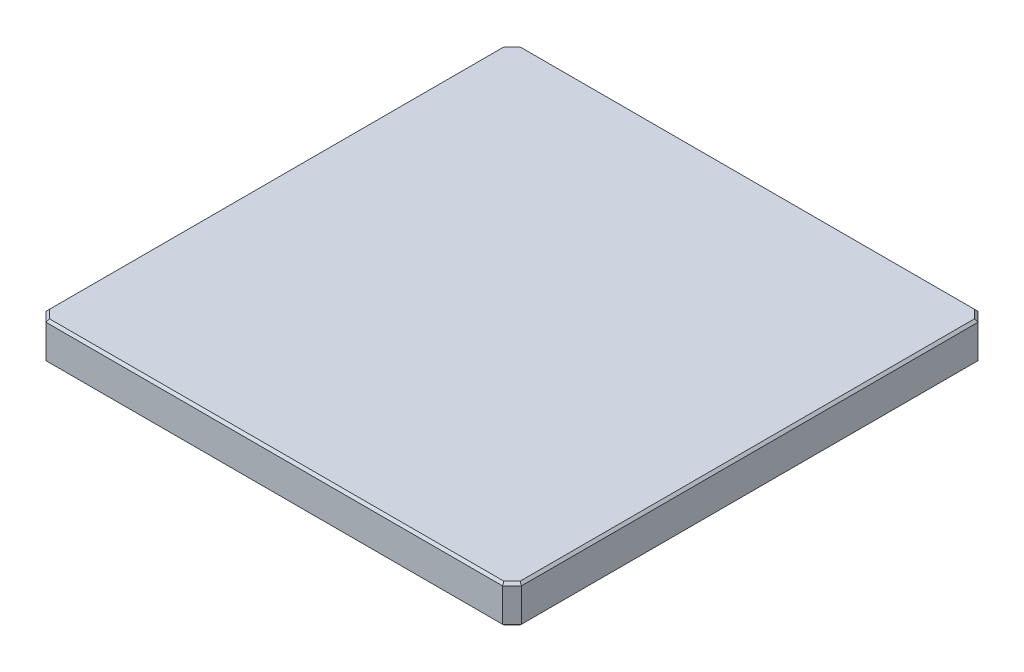
ISO-10303-21;
HEADER;
FILE_DESCRIPTION(('STEP AP214'),'2;1');
FILE_NAME('part.step','',(''),(''),'','','');
FILE_SCHEMA(('AUTOMOTIVE_DESIGN { 1 0 10303 214 1 1 1 1 }'));
ENDSEC;
DATA;
#1=APPLICATION_CONTEXT('core data for automotive mechanical design processes');
#2=APPLICATION_PROTOCOL_DEFINITION('international standard','automotive_design',2000,#1);
#3=PRODUCT_CONTEXT('',#1,'mechanical');
#4=PRODUCT('Part','Part','',(#3));
#5=PRODUCT_RELATED_PRODUCT_CATEGORY('part','',(#4));
#6=PRODUCT_DEFINITION_FORMATION('','',#4);
#7=PRODUCT_DEFINITION_CONTEXT('part definition',#1,'design');
#8=PRODUCT_DEFINITION('design','',#6,#7);
#9=PRODUCT_DEFINITION_SHAPE('','',#8);
#10=(LENGTH_UNIT() NAMED_UNIT(*) SI_UNIT(.MILLI.,.METRE.));
#11=(NAMED_UNIT(*) PLANE_ANGLE_UNIT() SI_UNIT($,.RADIAN.));
#12=(NAMED_UNIT(*) SI_UNIT($,.STERADIAN.) SOLID_ANGLE_UNIT());
#13=UNCERTAINTY_MEASURE_WITH_UNIT(LENGTH_MEASURE(1.E-05),#10,'distance_accuracy_value','');
#14=(GEOMETRIC_REPRESENTATION_CONTEXT(3) GLOBAL_UNCERTAINTY_ASSIGNED_CONTEXT((#13)) GLOBAL_UNIT_ASSIGNED_CONTEXT((#10,
#11,#12)) REPRESENTATION_CONTEXT('',''));
#15=CARTESIAN_POINT('',(0.,0.,0.));
#16=DIRECTION('',(0.,0.,1.));
#17=DIRECTION('',(1.,0.,0.));
#18=AXIS2_PLACEMENT_3D('',#15,#16,#17);
#19=CARTESIAN_POINT('',(50.,0.,100.));
#20=DIRECTION('',(-1.,0.,0.));
#21=DIRECTION('',(0.,0.,1.));
#22=AXIS2_PLACEMENT_3D('',#19,#20,#21);
#23=PLANE('',#22);
#24=DIRECTION('',(0.,-1.,0.));
#25=VECTOR('',#24,1.);
#26=CARTESIAN_POINT('',(50.,0.,98.));
#27=LINE('',#26,#25);
#28=CARTESIAN_POINT('',(50.,7.5,98.));
#29=VERTEX_POINT('',#28);
#30=CARTESIAN_POINT('',(50.,0.499999999999987,98.));
#31=VERTEX_POINT('',#30);
#32=EDGE_CURVE('E352',#29,#31,#27,.T.);
#33=ORIENTED_EDGE('',*,*,#32,.T.);
#34=DIRECTION('',(0.,0.,-1.));
#35=VECTOR('',#34,1.);
#36=CARTESIAN_POINT('',(50.,0.499999999999987,100.));
#37=LINE('',#36,#35);
#38=CARTESIAN_POINT('',(50.,0.499999999999987,2.00000000000002));
#39=VERTEX_POINT('',#38);
#40=EDGE_CURVE('E217',#31,#39,#37,.T.);
#41=ORIENTED_EDGE('',*,*,#40,.T.);
#42=DIRECTION('',(0.,1.,0.));
#43=VECTOR('',#42,1.);
#44=CARTESIAN_POINT('',(50.,8.,2.00000000000002));
#45=LINE('',#44,#43);
#46=CARTESIAN_POINT('',(50.,7.5,2.00000000000002));
#47=VERTEX_POINT('',#46);
#48=EDGE_CURVE('E356',#39,#47,#45,.T.);
#49=ORIENTED_EDGE('',*,*,#48,.T.);
#50=DIRECTION('',(0.,0.,1.));
#51=VECTOR('',#50,1.);
#52=CARTESIAN_POINT('',(50.,7.5,100.));
#53=LINE('',#52,#51);
#54=EDGE_CURVE('E214',#47,#29,#53,.T.);
#55=ORIENTED_EDGE('',*,*,#54,.T.);
#56=EDGE_LOOP('',(#33,#41,#49,#55));
#57=FACE_BOUND('',#56,.T.);
#58=ADVANCED_FACE('F47',(#57),#23,.F.);
#59=CARTESIAN_POINT('',(-50.,8.,100.));
#60=DIRECTION('',(0.,-1.,0.));
#61=DIRECTION('',(0.,0.,-1.));
#62=AXIS2_PLACEMENT_3D('',#59,#60,#61);
#63=PLANE('',#62);
#64=DIRECTION('',(0.,0.,-1.));
#65=VECTOR('',#64,1.);
#66=CARTESIAN_POINT('',(49.5,8.,100.));
#67=LINE('',#66,#65);
#68=CARTESIAN_POINT('',(49.5,8.,97.7928932188135));
#69=VERTEX_POINT('',#68);
#70=CARTESIAN_POINT('',(49.5,8.,2.20710678118655));
#71=VERTEX_POINT('',#70);
#72=EDGE_CURVE('E58',#69,#71,#67,.T.);
#73=ORIENTED_EDGE('',*,*,#72,.T.);
#74=DIRECTION('',(-0.707106781186548,0.,-0.707106781186548));
#75=VECTOR('',#74,1.);
#76=CARTESIAN_POINT('',(47.6464466094067,8.,0.353553390593266));
#77=LINE('',#76,#75);
#78=CARTESIAN_POINT('',(47.7928932188135,8.,0.5));
#79=VERTEX_POINT('',#78);
#80=EDGE_CURVE('E11',#71,#79,#77,.T.);
#81=ORIENTED_EDGE('',*,*,#80,.T.);
#82=DIRECTION('',(-1.,0.,0.));
#83=VECTOR('',#82,1.);
#84=CARTESIAN_POINT('',(-48.,8.,0.5));
#85=LINE('',#84,#83);
#86=CARTESIAN_POINT('',(-47.7928932188134,8.,0.5));
#87=VERTEX_POINT('',#86);
#88=EDGE_CURVE('E245',#79,#87,#85,.T.);
#89=ORIENTED_EDGE('',*,*,#88,.T.);
#90=DIRECTION('',(-0.707106781186548,0.,0.707106781186548));
#91=VECTOR('',#90,1.);
#92=CARTESIAN_POINT('',(-49.6464466094067,8.,2.35355339059329));
#93=LINE('',#92,#91);
#94=CARTESIAN_POINT('',(-49.5,8.,2.20710678118656));
#95=VERTEX_POINT('',#94);
#96=EDGE_CURVE('E248',#87,#95,#93,.T.);
#97=ORIENTED_EDGE('',*,*,#96,.T.);
#98=DIRECTION('',(0.,0.,1.));
#99=VECTOR('',#98,1.);
#100=CARTESIAN_POINT('',(-49.5,8.,100.));
#101=LINE('',#100,#99);
#102=CARTESIAN_POINT('',(-49.5,8.,97.7928932188135));
#103=VERTEX_POINT('',#102);
#104=EDGE_CURVE('E251',#95,#103,#101,.T.);
#105=ORIENTED_EDGE('',*,*,#104,.T.);
#106=DIRECTION('',(0.707106781186548,0.,0.707106781186548));
#107=VECTOR('',#106,1.);
#108=CARTESIAN_POINT('',(-47.6464466094067,8.,99.6464466094067));
#109=LINE('',#108,#107);
#110=CARTESIAN_POINT('',(-47.7928932188135,8.,99.5));
#111=VERTEX_POINT('',#110);
#112=EDGE_CURVE('E254',#103,#111,#109,.T.);
#113=ORIENTED_EDGE('',*,*,#112,.T.);
#114=DIRECTION('',(1.,0.,0.));
#115=VECTOR('',#114,1.);
#116=CARTESIAN_POINT('',(-50.,8.,99.5));
#117=LINE('',#116,#115);
#118=CARTESIAN_POINT('',(47.7928932188134,8.,99.5));
#119=VERTEX_POINT('',#118);
#120=EDGE_CURVE('E257',#111,#119,#117,.T.);
#121=ORIENTED_EDGE('',*,*,#120,.T.);
#122=DIRECTION('',(0.707106781186548,0.,-0.707106781186548));
#123=VECTOR('',#122,1.);
#124=CARTESIAN_POINT('',(49.6464466094067,8.,97.6464466094067));
#125=LINE('',#124,#123);
#126=EDGE_CURVE('E69',#119,#69,#125,.T.);
#127=ORIENTED_EDGE('',*,*,#126,.T.);
#128=EDGE_LOOP('',(#73,#81,#89,#97,#105,#113,#121,#127));
#129=FACE_BOUND('',#128,.T.);
#130=ADVANCED_FACE('F405',(#129),#63,.F.);
#131=CARTESIAN_POINT('',(-50.,0.,100.));
#132=DIRECTION('',(1.,0.,0.));
#133=DIRECTION('',(0.,0.,-1.));
#134=AXIS2_PLACEMENT_3D('',#131,#132,#133);
#135=PLANE('',#134);
#136=DIRECTION('',(0.,-1.,0.));
#137=VECTOR('',#136,1.);
#138=CARTESIAN_POINT('',(-50.,0.,2.00000000000002));
#139=LINE('',#138,#137);
#140=CARTESIAN_POINT('',(-50.,7.5,2.00000000000002));
#141=VERTEX_POINT('',#140);
#142=CARTESIAN_POINT('',(-50.,0.499999999999987,2.00000000000002));
#143=VERTEX_POINT('',#142);
#144=EDGE_CURVE('E339',#141,#143,#139,.T.);
#145=ORIENTED_EDGE('',*,*,#144,.T.);
#146=DIRECTION('',(0.,0.,1.));
#147=VECTOR('',#146,1.);
#148=CARTESIAN_POINT('',(-50.,0.499999999999987,100.));
#149=LINE('',#148,#147);
#150=CARTESIAN_POINT('',(-50.,0.499999999999987,98.));
#151=VERTEX_POINT('',#150);
#152=EDGE_CURVE('E242',#143,#151,#149,.T.);
#153=ORIENTED_EDGE('',*,*,#152,.T.);
#154=DIRECTION('',(0.,1.,0.));
#155=VECTOR('',#154,1.);
#156=CARTESIAN_POINT('',(-50.,0.,98.));
#157=LINE('',#156,#155);
#158=CARTESIAN_POINT('',(-50.,7.5,98.));
#159=VERTEX_POINT('',#158);
#160=EDGE_CURVE('E288',#151,#159,#157,.T.);
#161=ORIENTED_EDGE('',*,*,#160,.T.);
#162=DIRECTION('',(0.,0.,-1.));
#163=VECTOR('',#162,1.);
#164=CARTESIAN_POINT('',(-50.,7.5,100.));
#165=LINE('',#164,#163);
#166=EDGE_CURVE('E239',#159,#141,#165,.T.);
#167=ORIENTED_EDGE('',*,*,#166,.T.);
#168=EDGE_LOOP('',(#145,#153,#161,#167));
#169=FACE_BOUND('',#168,.T.);
#170=ADVANCED_FACE('F336',(#169),#135,.F.);
#171=CARTESIAN_POINT('',(-50.,0.,100.));
#172=DIRECTION('',(0.,1.,0.));
#173=DIRECTION('',(0.,0.,1.));
#174=AXIS2_PLACEMENT_3D('',#171,#172,#173);
#175=PLANE('',#174);
#176=DIRECTION('',(-1.,0.,0.));
#177=VECTOR('',#176,1.);
#178=CARTESIAN_POINT('',(-50.,0.,99.5));
#179=LINE('',#178,#177);
#180=CARTESIAN_POINT('',(47.7928932188135,0.,99.5));
#181=VERTEX_POINT('',#180);
#182=CARTESIAN_POINT('',(-47.7928932188135,0.,99.5));
#183=VERTEX_POINT('',#182);
#184=EDGE_CURVE('E188',#181,#183,#179,.T.);
#185=ORIENTED_EDGE('',*,*,#184,.T.);
#186=DIRECTION('',(-0.707106781186548,0.,-0.707106781186548));
#187=VECTOR('',#186,1.);
#188=CARTESIAN_POINT('',(-49.6464466094067,0.,97.6464466094068));
#189=LINE('',#188,#187);
#190=CARTESIAN_POINT('',(-49.5,0.,97.7928932188135));
#191=VERTEX_POINT('',#190);
#192=EDGE_CURVE('E167',#183,#191,#189,.T.);
#193=ORIENTED_EDGE('',*,*,#192,.T.);
#194=DIRECTION('',(0.,0.,-1.));
#195=VECTOR('',#194,1.);
#196=CARTESIAN_POINT('',(-49.5,0.,100.));
#197=LINE('',#196,#195);
#198=CARTESIAN_POINT('',(-49.5,0.,2.20710678118658));
#199=VERTEX_POINT('',#198);
#200=EDGE_CURVE('E176',#191,#199,#197,.T.);
#201=ORIENTED_EDGE('',*,*,#200,.T.);
#202=DIRECTION('',(0.707106781186548,0.,-0.707106781186548));
#203=VECTOR('',#202,1.);
#204=CARTESIAN_POINT('',(-47.6464466094067,0.,0.353553390593275));
#205=LINE('',#204,#203);
#206=CARTESIAN_POINT('',(-47.7928932188134,0.,0.499999999999988));
#207=VERTEX_POINT('',#206);
#208=EDGE_CURVE('E183',#199,#207,#205,.T.);
#209=ORIENTED_EDGE('',*,*,#208,.T.);
#210=DIRECTION('',(1.,0.,0.));
#211=VECTOR('',#210,1.);
#212=CARTESIAN_POINT('',(48.,0.,0.499999999999987));
#213=LINE('',#212,#211);
#214=CARTESIAN_POINT('',(47.7928932188134,0.,0.499999999999987));
#215=VERTEX_POINT('',#214);
#216=EDGE_CURVE('E368',#207,#215,#213,.T.);
#217=ORIENTED_EDGE('',*,*,#216,.T.);
#218=DIRECTION('',(0.707106781186548,0.,0.707106781186548));
#219=VECTOR('',#218,1.);
#220=CARTESIAN_POINT('',(49.6464466094067,0.,2.35355339059328));
#221=LINE('',#220,#219);
#222=CARTESIAN_POINT('',(49.5,0.,2.20710678118656));
#223=VERTEX_POINT('',#222);
#224=EDGE_CURVE('E371',#215,#223,#221,.T.);
#225=ORIENTED_EDGE('',*,*,#224,.T.);
#226=DIRECTION('',(0.,0.,1.));
#227=VECTOR('',#226,1.);
#228=CARTESIAN_POINT('',(49.5,0.,100.));
#229=LINE('',#228,#227);
#230=CARTESIAN_POINT('',(49.5,0.,97.7928932188135));
#231=VERTEX_POINT('',#230);
#232=EDGE_CURVE('E374',#223,#231,#229,.T.);
#233=ORIENTED_EDGE('',*,*,#232,.T.);
#234=DIRECTION('',(-0.707106781186548,0.,0.707106781186548));
#235=VECTOR('',#234,1.);
#236=CARTESIAN_POINT('',(47.6464466094068,0.,99.6464466094068));
#237=LINE('',#236,#235);
#238=EDGE_CURVE('E196',#231,#181,#237,.T.);
#239=ORIENTED_EDGE('',*,*,#238,.T.);
#240=EDGE_LOOP('',(#185,#193,#201,#209,#217,#225,#233,#239));
#241=FACE_BOUND('',#240,.T.);
#242=ADVANCED_FACE('F186',(#241),#175,.F.);
#243=CARTESIAN_POINT('',(0.,0.,100.));
#244=DIRECTION('',(0.,0.,-1.));
#245=DIRECTION('',(-1.,0.,0.));
#246=AXIS2_PLACEMENT_3D('',#243,#244,#245);
#247=PLANE('',#246);
#248=DIRECTION('',(0.,-1.,0.));
#249=VECTOR('',#248,1.);
#250=CARTESIAN_POINT('',(-48.,0.,100.));
#251=LINE('',#250,#249);
#252=CARTESIAN_POINT('',(-48.,7.5,100.));
#253=VERTEX_POINT('',#252);
#254=CARTESIAN_POINT('',(-48.,0.499999999999987,100.));
#255=VERTEX_POINT('',#254);
#256=EDGE_CURVE('E184',#253,#255,#251,.T.);
#257=ORIENTED_EDGE('',*,*,#256,.T.);
#258=DIRECTION('',(1.,0.,0.));
#259=VECTOR('',#258,1.);
#260=CARTESIAN_POINT('',(0.,0.499999999999987,100.));
#261=LINE('',#260,#259);
#262=CARTESIAN_POINT('',(48.,0.499999999999989,100.));
#263=VERTEX_POINT('',#262);
#264=EDGE_CURVE('E205',#255,#263,#261,.T.);
#265=ORIENTED_EDGE('',*,*,#264,.T.);
#266=DIRECTION('',(0.,1.,0.));
#267=VECTOR('',#266,1.);
#268=CARTESIAN_POINT('',(48.,0.,100.));
#269=LINE('',#268,#267);
#270=CARTESIAN_POINT('',(48.,7.5,100.));
#271=VERTEX_POINT('',#270);
#272=EDGE_CURVE('E360',#263,#271,#269,.T.);
#273=ORIENTED_EDGE('',*,*,#272,.T.);
#274=DIRECTION('',(-1.,0.,0.));
#275=VECTOR('',#274,1.);
#276=CARTESIAN_POINT('',(0.,7.5,100.));
#277=LINE('',#276,#275);
#278=EDGE_CURVE('E202',#271,#253,#277,.T.);
#279=ORIENTED_EDGE('',*,*,#278,.T.);
#280=EDGE_LOOP('',(#257,#265,#273,#279));
#281=FACE_BOUND('',#280,.T.);
#282=ADVANCED_FACE('F389',(#281),#247,.F.);
#283=CARTESIAN_POINT('',(0.,0.,0.));
#284=DIRECTION('',(0.,0.,-1.));
#285=DIRECTION('',(-1.,0.,0.));
#286=AXIS2_PLACEMENT_3D('',#283,#284,#285);
#287=PLANE('',#286);
#288=DIRECTION('',(0.,-1.,0.));
#289=VECTOR('',#288,1.);
#290=CARTESIAN_POINT('',(48.,0.,0.));
#291=LINE('',#290,#289);
#292=CARTESIAN_POINT('',(48.,7.5,0.));
#293=VERTEX_POINT('',#292);
#294=CARTESIAN_POINT('',(48.,0.499999999999987,0.));
#295=VERTEX_POINT('',#294);
#296=EDGE_CURVE('E342',#293,#295,#291,.T.);
#297=ORIENTED_EDGE('',*,*,#296,.T.);
#298=DIRECTION('',(-1.,0.,0.));
#299=VECTOR('',#298,1.);
#300=CARTESIAN_POINT('',(-48.,0.499999999999987,0.));
#301=LINE('',#300,#299);
#302=CARTESIAN_POINT('',(-48.,0.499999999999992,0.));
#303=VERTEX_POINT('',#302);
#304=EDGE_CURVE('E230',#295,#303,#301,.T.);
#305=ORIENTED_EDGE('',*,*,#304,.T.);
#306=DIRECTION('',(0.,1.,0.));
#307=VECTOR('',#306,1.);
#308=CARTESIAN_POINT('',(-48.,8.,0.));
#309=LINE('',#308,#307);
#310=CARTESIAN_POINT('',(-48.,7.5,0.));
#311=VERTEX_POINT('',#310);
#312=EDGE_CURVE('E348',#303,#311,#309,.T.);
#313=ORIENTED_EDGE('',*,*,#312,.T.);
#314=DIRECTION('',(1.,0.,0.));
#315=VECTOR('',#314,1.);
#316=CARTESIAN_POINT('',(48.,7.5,0.));
#317=LINE('',#316,#315);
#318=EDGE_CURVE('E227',#311,#293,#317,.T.);
#319=ORIENTED_EDGE('',*,*,#318,.T.);
#320=EDGE_LOOP('',(#297,#305,#313,#319));
#321=FACE_BOUND('',#320,.T.);
#322=ADVANCED_FACE('F417',(#321),#287,.T.);
#323=CARTESIAN_POINT('',(-50.,0.,2.00000000000002));
#324=DIRECTION('',(-0.707106781186547,0.,-0.707106781186547));
#325=DIRECTION('',(0.,1.,0.));
#326=AXIS2_PLACEMENT_3D('',#323,#324,#325);
#327=PLANE('',#326);
#328=ORIENTED_EDGE('',*,*,#312,.F.);
#329=DIRECTION('',(-0.707106781186548,0.,0.707106781186548));
#330=VECTOR('',#329,1.);
#331=CARTESIAN_POINT('',(-50.,0.499999999999992,2.00000000000002));
#332=LINE('',#331,#330);
#333=EDGE_CURVE('E236',#303,#143,#332,.T.);
#334=ORIENTED_EDGE('',*,*,#333,.T.);
#335=ORIENTED_EDGE('',*,*,#144,.F.);
#336=DIRECTION('',(0.707106781186548,0.,-0.707106781186548));
#337=VECTOR('',#336,1.);
#338=CARTESIAN_POINT('',(-48.,7.5,0.));
#339=LINE('',#338,#337);
#340=EDGE_CURVE('E233',#141,#311,#339,.T.);
#341=ORIENTED_EDGE('',*,*,#340,.T.);
#342=EDGE_LOOP('',(#328,#334,#335,#341));
#343=FACE_BOUND('',#342,.T.);
#344=ADVANCED_FACE('F442',(#343),#327,.T.);
#345=CARTESIAN_POINT('',(50.,0.,2.00000000000002));
#346=DIRECTION('',(0.707106781186547,0.,-0.707106781186547));
#347=DIRECTION('',(0.,-1.,0.));
#348=AXIS2_PLACEMENT_3D('',#345,#346,#347);
#349=PLANE('',#348);
#350=ORIENTED_EDGE('',*,*,#48,.F.);
#351=DIRECTION('',(-0.707106781186548,0.,-0.707106781186548));
#352=VECTOR('',#351,1.);
#353=CARTESIAN_POINT('',(48.,0.499999999999987,0.));
#354=LINE('',#353,#352);
#355=EDGE_CURVE('E224',#39,#295,#354,.T.);
#356=ORIENTED_EDGE('',*,*,#355,.T.);
#357=ORIENTED_EDGE('',*,*,#296,.F.);
#358=DIRECTION('',(0.707106781186548,0.,0.707106781186548));
#359=VECTOR('',#358,1.);
#360=CARTESIAN_POINT('',(50.,7.5,2.00000000000002));
#361=LINE('',#360,#359);
#362=EDGE_CURVE('E220',#293,#47,#361,.T.);
#363=ORIENTED_EDGE('',*,*,#362,.T.);
#364=EDGE_LOOP('',(#350,#356,#357,#363));
#365=FACE_BOUND('',#364,.T.);
#366=ADVANCED_FACE('F422',(#365),#349,.T.);
#367=CARTESIAN_POINT('',(-48.,0.,100.));
#368=DIRECTION('',(0.707106781186547,0.,-0.707106781186547));
#369=DIRECTION('',(0.,-1.,0.));
#370=AXIS2_PLACEMENT_3D('',#367,#368,#369);
#371=PLANE('',#370);
#372=ORIENTED_EDGE('',*,*,#160,.F.);
#373=DIRECTION('',(-0.707106781186548,0.,-0.707106781186548));
#374=VECTOR('',#373,1.);
#375=CARTESIAN_POINT('',(-48.,0.499999999999987,100.));
#376=LINE('',#375,#374);
#377=EDGE_CURVE('E169',#151,#255,#376,.F.);
#378=ORIENTED_EDGE('',*,*,#377,.T.);
#379=ORIENTED_EDGE('',*,*,#256,.F.);
#380=DIRECTION('',(0.707106781186548,0.,0.707106781186548));
#381=VECTOR('',#380,1.);
#382=CARTESIAN_POINT('',(-50.,7.5,98.));
#383=LINE('',#382,#381);
#384=EDGE_CURVE('E191',#253,#159,#383,.F.);
#385=ORIENTED_EDGE('',*,*,#384,.T.);
#386=EDGE_LOOP('',(#372,#378,#379,#385));
#387=FACE_BOUND('',#386,.T.);
#388=ADVANCED_FACE('F332',(#387),#371,.F.);
#389=CARTESIAN_POINT('',(48.,0.,100.));
#390=DIRECTION('',(-0.707106781186547,0.,-0.707106781186547));
#391=DIRECTION('',(0.,1.,0.));
#392=AXIS2_PLACEMENT_3D('',#389,#390,#391);
#393=PLANE('',#392);
#394=ORIENTED_EDGE('',*,*,#272,.F.);
#395=DIRECTION('',(-0.707106781186548,0.,0.707106781186548));
#396=VECTOR('',#395,1.);
#397=CARTESIAN_POINT('',(50.,0.499999999999989,98.));
#398=LINE('',#397,#396);
#399=EDGE_CURVE('E211',#263,#31,#398,.F.);
#400=ORIENTED_EDGE('',*,*,#399,.T.);
#401=ORIENTED_EDGE('',*,*,#32,.F.);
#402=DIRECTION('',(0.707106781186548,0.,-0.707106781186548));
#403=VECTOR('',#402,1.);
#404=CARTESIAN_POINT('',(48.,7.5,100.));
#405=LINE('',#404,#403);
#406=EDGE_CURVE('E208',#29,#271,#405,.F.);
#407=ORIENTED_EDGE('',*,*,#406,.T.);
#408=EDGE_LOOP('',(#394,#400,#401,#407));
#409=FACE_BOUND('',#408,.T.);
#410=ADVANCED_FACE('F391',(#409),#393,.F.);
#411=CARTESIAN_POINT('',(48.6464466094067,0.,1.35355339059327));
#412=DIRECTION('',(0.499999999999999,-0.707106781186549,-0.499999999999999));
#413=DIRECTION('',(-0.707106781186548,0.,-0.707106781186548));
#414=AXIS2_PLACEMENT_3D('',#411,#412,#413);
#415=PLANE('',#414);
#416=DIRECTION('',(-0.281084637714823,-0.678598344545846,0.678598344545846));
#417=VECTOR('',#416,1.);
#418=CARTESIAN_POINT('',(40.0664162213606,-18.6533655566141,19.1533655566141));
#419=LINE('',#418,#417);
#420=EDGE_CURVE('E280',#295,#215,#419,.T.);
#421=ORIENTED_EDGE('',*,*,#420,.F.);
#422=ORIENTED_EDGE('',*,*,#355,.F.);
#423=DIRECTION('',(0.678598344545846,0.678598344545846,-0.281084637714823));
#424=VECTOR('',#423,1.);
#425=CARTESIAN_POINT('',(49.2697521433898,-0.230247856610183,2.30247856610183));
#426=LINE('',#425,#424);
#427=EDGE_CURVE('E284',#223,#39,#426,.T.);
#428=ORIENTED_EDGE('',*,*,#427,.F.);
#429=ORIENTED_EDGE('',*,*,#224,.F.);
#430=EDGE_LOOP('',(#421,#422,#428,#429));
#431=FACE_BOUND('',#430,.T.);
#432=ADVANCED_FACE('F426',(#431),#415,.T.);
#433=CARTESIAN_POINT('',(50.,0.499999999999987,100.));
#434=DIRECTION('',(-0.707106781186548,0.707106781186548,0.));
#435=DIRECTION('',(0.,0.,-1.));
#436=AXIS2_PLACEMENT_3D('',#433,#434,#435);
#437=PLANE('',#436);
#438=ORIENTED_EDGE('',*,*,#427,.T.);
#439=ORIENTED_EDGE('',*,*,#40,.F.);
#440=DIRECTION('',(-0.678598344545852,-0.678598344545852,-0.281084637714796));
#441=VECTOR('',#440,1.);
#442=CARTESIAN_POINT('',(50.3814871396611,0.881487139661048,98.1580171471185));
#443=LINE('',#442,#441);
#444=EDGE_CURVE('E276',#231,#31,#443,.F.);
#445=ORIENTED_EDGE('',*,*,#444,.F.);
#446=ORIENTED_EDGE('',*,*,#232,.F.);
#447=EDGE_LOOP('',(#438,#439,#445,#446));
#448=FACE_BOUND('',#447,.T.);
#449=ADVANCED_FACE('F431',(#448),#437,.F.);
#450=CARTESIAN_POINT('',(-50.,0.,0.499999999999987));
#451=DIRECTION('',(0.,-0.707106781186548,-0.707106781186548));
#452=DIRECTION('',(-1.,0.,0.));
#453=AXIS2_PLACEMENT_3D('',#450,#451,#452);
#454=PLANE('',#453);
#455=ORIENTED_EDGE('',*,*,#420,.T.);
#456=ORIENTED_EDGE('',*,*,#216,.F.);
#457=DIRECTION('',(0.281084637714845,-0.678598344545842,0.678598344545842));
#458=VECTOR('',#457,1.);
#459=CARTESIAN_POINT('',(-42.1107716203343,-13.7178550261,14.2178550260999));
#460=LINE('',#459,#458);
#461=EDGE_CURVE('E272',#303,#207,#460,.T.);
#462=ORIENTED_EDGE('',*,*,#461,.F.);
#463=ORIENTED_EDGE('',*,*,#304,.F.);
#464=EDGE_LOOP('',(#455,#456,#462,#463));
#465=FACE_BOUND('',#464,.T.);
#466=ADVANCED_FACE('F492',(#465),#454,.T.);
#467=CARTESIAN_POINT('',(-1.35355339059325,0.,148.646446609407));
#468=DIRECTION('',(-0.500000000000007,0.707106781186538,-0.500000000000007));
#469=DIRECTION('',(-0.707106781186548,0.,0.707106781186548));
#470=AXIS2_PLACEMENT_3D('',#467,#468,#469);
#471=PLANE('',#470);
#472=ORIENTED_EDGE('',*,*,#444,.T.);
#473=ORIENTED_EDGE('',*,*,#399,.F.);
#474=DIRECTION('',(-0.281084637714796,-0.678598344545852,-0.678598344545852));
#475=VECTOR('',#474,1.);
#476=CARTESIAN_POINT('',(53.2842712474619,13.2573593128818,112.757359312882));
#477=LINE('',#476,#475);
#478=EDGE_CURVE('E268',#181,#263,#477,.F.);
#479=ORIENTED_EDGE('',*,*,#478,.F.);
#480=ORIENTED_EDGE('',*,*,#238,.F.);
#481=EDGE_LOOP('',(#472,#473,#479,#480));
#482=FACE_BOUND('',#481,.T.);
#483=ADVANCED_FACE('F383',(#482),#471,.F.);
#484=CARTESIAN_POINT('',(-98.6464466094067,0.,51.3535533905933));
#485=DIRECTION('',(-0.499999999999993,-0.707106781186557,-0.499999999999993));
#486=DIRECTION('',(-0.707106781186548,0.,0.707106781186548));
#487=AXIS2_PLACEMENT_3D('',#484,#485,#486);
#488=PLANE('',#487);
#489=ORIENTED_EDGE('',*,*,#461,.T.);
#490=ORIENTED_EDGE('',*,*,#208,.F.);
#491=DIRECTION('',(-0.678598344545842,0.678598344545842,-0.281084637714845));
#492=VECTOR('',#491,1.);
#493=CARTESIAN_POINT('',(-30.8466344433846,-18.6533655566154,9.93358377864055));
#494=LINE('',#493,#492);
#495=EDGE_CURVE('E179',#143,#199,#494,.F.);
#496=ORIENTED_EDGE('',*,*,#495,.F.);
#497=ORIENTED_EDGE('',*,*,#333,.F.);
#498=EDGE_LOOP('',(#489,#490,#496,#497));
#499=FACE_BOUND('',#498,.T.);
#500=ADVANCED_FACE('F480',(#499),#488,.T.);
#501=CARTESIAN_POINT('',(0.,0.499999999999987,100.));
#502=DIRECTION('',(0.,0.707106781186548,-0.707106781186548));
#503=DIRECTION('',(1.,0.,0.));
#504=AXIS2_PLACEMENT_3D('',#501,#502,#503);
#505=PLANE('',#504);
#506=ORIENTED_EDGE('',*,*,#478,.T.);
#507=ORIENTED_EDGE('',*,*,#264,.F.);
#508=DIRECTION('',(0.281084637714815,-0.678598344545848,-0.678598344545848));
#509=VECTOR('',#508,1.);
#510=CARTESIAN_POINT('',(-44.2075884691551,-8.65569135186607,90.8443086481339));
#511=LINE('',#510,#509);
#512=EDGE_CURVE('E173',#183,#255,#511,.F.);
#513=ORIENTED_EDGE('',*,*,#512,.F.);
#514=ORIENTED_EDGE('',*,*,#184,.F.);
#515=EDGE_LOOP('',(#506,#507,#513,#514));
#516=FACE_BOUND('',#515,.T.);
#517=ADVANCED_FACE('F386',(#516),#505,.F.);
#518=CARTESIAN_POINT('',(-49.5,0.,100.));
#519=DIRECTION('',(0.707106781186548,0.707106781186548,0.));
#520=DIRECTION('',(0.,0.,-1.));
#521=AXIS2_PLACEMENT_3D('',#518,#519,#520);
#522=PLANE('',#521);
#523=ORIENTED_EDGE('',*,*,#495,.T.);
#524=ORIENTED_EDGE('',*,*,#200,.F.);
#525=DIRECTION('',(-0.678598344545848,0.678598344545848,0.281084637714815));
#526=VECTOR('',#525,1.);
#527=CARTESIAN_POINT('',(-49.9209914264407,0.420991426440717,97.967273577288));
#528=LINE('',#527,#526);
#529=EDGE_CURVE('E163',#151,#191,#528,.F.);
#530=ORIENTED_EDGE('',*,*,#529,.F.);
#531=ORIENTED_EDGE('',*,*,#152,.F.);
#532=EDGE_LOOP('',(#523,#524,#530,#531));
#533=FACE_BOUND('',#532,.T.);
#534=ADVANCED_FACE('F177',(#533),#522,.F.);
#535=CARTESIAN_POINT('',(-48.6464466094068,0.,98.6464466094068));
#536=DIRECTION('',(0.500000000000002,0.707106781186545,-0.500000000000002));
#537=DIRECTION('',(-0.707106781186548,0.,-0.707106781186548));
#538=AXIS2_PLACEMENT_3D('',#535,#536,#537);
#539=PLANE('',#538);
#540=ORIENTED_EDGE('',*,*,#512,.T.);
#541=ORIENTED_EDGE('',*,*,#377,.F.);
#542=ORIENTED_EDGE('',*,*,#529,.T.);
#543=ORIENTED_EDGE('',*,*,#192,.F.);
#544=EDGE_LOOP('',(#540,#541,#542,#543));
#545=FACE_BOUND('',#544,.T.);
#546=ADVANCED_FACE('F165',(#545),#539,.F.);
#547=CARTESIAN_POINT('',(-48.6464466094067,8.,98.6464466094068));
#548=DIRECTION('',(0.500000000000004,-0.707106781186543,-0.500000000000004));
#549=DIRECTION('',(0.707106781186548,0.,0.707106781186548));
#550=AXIS2_PLACEMENT_3D('',#547,#548,#549);
#551=PLANE('',#550);
#552=DIRECTION('',(0.678598344545849,0.678598344545849,-0.281084637714808));
#553=VECTOR('',#552,1.);
#554=CARTESIAN_POINT('',(-50.3814871396611,7.11851286033893,98.1580171471185));
#555=LINE('',#554,#553);
#556=EDGE_CURVE('E310',#159,#103,#555,.T.);
#557=ORIENTED_EDGE('',*,*,#556,.F.);
#558=ORIENTED_EDGE('',*,*,#384,.F.);
#559=DIRECTION('',(0.281084637714808,0.67859834454585,-0.67859834454585));
#560=VECTOR('',#559,1.);
#561=CARTESIAN_POINT('',(-47.6975214338982,8.23024785661019,99.2697521433898));
#562=LINE('',#561,#560);
#563=EDGE_CURVE('E52',#111,#253,#562,.F.);
#564=ORIENTED_EDGE('',*,*,#563,.F.);
#565=ORIENTED_EDGE('',*,*,#112,.F.);
#566=EDGE_LOOP('',(#557,#558,#564,#565));
#567=FACE_BOUND('',#566,.T.);
#568=ADVANCED_FACE('F50',(#567),#551,.F.);
#569=CARTESIAN_POINT('',(0.,7.5,100.));
#570=DIRECTION('',(0.,-0.707106781186547,-0.707106781186547));
#571=DIRECTION('',(-1.,0.,0.));
#572=AXIS2_PLACEMENT_3D('',#569,#570,#571);
#573=PLANE('',#572);
#574=ORIENTED_EDGE('',*,*,#563,.T.);
#575=ORIENTED_EDGE('',*,*,#278,.F.);
#576=DIRECTION('',(-0.281084637714832,0.678598344545845,-0.678598344545845));
#577=VECTOR('',#576,1.);
#578=CARTESIAN_POINT('',(44.2075884691546,16.6556913518666,90.8443086481334));
#579=LINE('',#578,#577);
#580=EDGE_CURVE('E307',#119,#271,#579,.F.);
#581=ORIENTED_EDGE('',*,*,#580,.F.);
#582=ORIENTED_EDGE('',*,*,#120,.F.);
#583=EDGE_LOOP('',(#574,#575,#581,#582));
#584=FACE_BOUND('',#583,.T.);
#585=ADVANCED_FACE('F323',(#584),#573,.F.);
#586=CARTESIAN_POINT('',(-50.,7.5,100.));
#587=DIRECTION('',(0.707106781186547,-0.707106781186547,0.));
#588=DIRECTION('',(0.,0.,-1.));
#589=AXIS2_PLACEMENT_3D('',#586,#587,#588);
#590=PLANE('',#589);
#591=ORIENTED_EDGE('',*,*,#556,.T.);
#592=ORIENTED_EDGE('',*,*,#104,.F.);
#593=DIRECTION('',(-0.678598344545847,-0.678598344545847,-0.28108463771482));
#594=VECTOR('',#593,1.);
#595=CARTESIAN_POINT('',(-62.7573593128807,-5.25735931288071,-3.28427124746187));
#596=LINE('',#595,#594);
#597=EDGE_CURVE('E303',#141,#95,#596,.F.);
#598=ORIENTED_EDGE('',*,*,#597,.F.);
#599=ORIENTED_EDGE('',*,*,#166,.F.);
#600=EDGE_LOOP('',(#591,#592,#598,#599));
#601=FACE_BOUND('',#600,.T.);
#602=ADVANCED_FACE('F533',(#601),#590,.F.);
#603=CARTESIAN_POINT('',(-1.35355339059327,8.,148.646446609407));
#604=DIRECTION('',(-0.499999999999996,-0.707106781186552,-0.499999999999996));
#605=DIRECTION('',(0.707106781186548,0.,-0.707106781186548));
#606=AXIS2_PLACEMENT_3D('',#603,#604,#605);
#607=PLANE('',#606);
#608=ORIENTED_EDGE('',*,*,#580,.T.);
#609=ORIENTED_EDGE('',*,*,#406,.F.);
#610=DIRECTION('',(-0.678598344545845,0.678598344545845,-0.281084637714832));
#611=VECTOR('',#610,1.);
#612=CARTESIAN_POINT('',(35.7821449738995,21.7178550261005,92.1107716203344));
#613=LINE('',#612,#611);
#614=EDGE_CURVE('E299',#69,#29,#613,.F.);
#615=ORIENTED_EDGE('',*,*,#614,.F.);
#616=ORIENTED_EDGE('',*,*,#126,.F.);
#617=EDGE_LOOP('',(#608,#609,#615,#616));
#618=FACE_BOUND('',#617,.T.);
#619=ADVANCED_FACE('F395',(#618),#607,.F.);
#620=CARTESIAN_POINT('',(-98.6464466094067,8.,51.3535533905933));
#621=DIRECTION('',(-0.5,0.707106781186547,-0.5));
#622=DIRECTION('',(0.707106781186548,0.,-0.707106781186548));
#623=AXIS2_PLACEMENT_3D('',#620,#621,#622);
#624=PLANE('',#623);
#625=ORIENTED_EDGE('',*,*,#597,.T.);
#626=ORIENTED_EDGE('',*,*,#96,.F.);
#627=DIRECTION('',(0.28108463771482,0.678598344545847,0.678598344545847));
#628=VECTOR('',#627,1.);
#629=CARTESIAN_POINT('',(-47.967273577288,7.57900857355927,0.0790085735592686));
#630=LINE('',#629,#628);
#631=EDGE_CURVE('E295',#311,#87,#630,.T.);
#632=ORIENTED_EDGE('',*,*,#631,.F.);
#633=ORIENTED_EDGE('',*,*,#340,.F.);
#634=EDGE_LOOP('',(#625,#626,#632,#633));
#635=FACE_BOUND('',#634,.T.);
#636=ADVANCED_FACE('F410',(#635),#624,.T.);
#637=CARTESIAN_POINT('',(49.5,8.,100.));
#638=DIRECTION('',(-0.707106781186547,-0.707106781186547,0.));
#639=DIRECTION('',(0.,0.,-1.));
#640=AXIS2_PLACEMENT_3D('',#637,#638,#639);
#641=PLANE('',#640);
#642=ORIENTED_EDGE('',*,*,#614,.T.);
#643=ORIENTED_EDGE('',*,*,#54,.F.);
#644=DIRECTION('',(0.678598344545851,-0.678598344545851,-0.281084637714799));
#645=VECTOR('',#644,1.);
#646=CARTESIAN_POINT('',(30.8466344433874,26.6533655566126,9.93358377863803));
#647=LINE('',#646,#645);
#648=EDGE_CURVE('E292',#71,#47,#647,.T.);
#649=ORIENTED_EDGE('',*,*,#648,.F.);
#650=ORIENTED_EDGE('',*,*,#72,.F.);
#651=EDGE_LOOP('',(#642,#643,#649,#650));
#652=FACE_BOUND('',#651,.T.);
#653=ADVANCED_FACE('F398',(#652),#641,.F.);
#654=CARTESIAN_POINT('',(-50.,8.,0.5));
#655=DIRECTION('',(0.,0.707106781186547,-0.707106781186547));
#656=DIRECTION('',(1.,0.,0.));
#657=AXIS2_PLACEMENT_3D('',#654,#655,#656);
#658=PLANE('',#657);
#659=ORIENTED_EDGE('',*,*,#631,.T.);
#660=ORIENTED_EDGE('',*,*,#88,.F.);
#661=DIRECTION('',(0.281084637714799,-0.678598344545851,-0.678598344545851));
#662=VECTOR('',#661,1.);
#663=CARTESIAN_POINT('',(40.066416221362,26.6533655566126,19.1533655566126));
#664=LINE('',#663,#662);
#665=EDGE_CURVE('E289',#293,#79,#664,.F.);
#666=ORIENTED_EDGE('',*,*,#665,.F.);
#667=ORIENTED_EDGE('',*,*,#318,.F.);
#668=EDGE_LOOP('',(#659,#660,#666,#667));
#669=FACE_BOUND('',#668,.T.);
#670=ADVANCED_FACE('F414',(#669),#658,.T.);
#671=CARTESIAN_POINT('',(48.6464466094067,8.,1.35355339059327));
#672=DIRECTION('',(0.500000000000006,0.707106781186539,-0.500000000000006));
#673=DIRECTION('',(0.707106781186548,0.,0.707106781186548));
#674=AXIS2_PLACEMENT_3D('',#671,#672,#673);
#675=PLANE('',#674);
#676=ORIENTED_EDGE('',*,*,#648,.T.);
#677=ORIENTED_EDGE('',*,*,#362,.F.);
#678=ORIENTED_EDGE('',*,*,#665,.T.);
#679=ORIENTED_EDGE('',*,*,#80,.F.);
#680=EDGE_LOOP('',(#676,#677,#678,#679));
#681=FACE_BOUND('',#680,.T.);
#682=ADVANCED_FACE('F402',(#681),#675,.T.);
#683=CLOSED_SHELL('',(#58,#130,#170,#242,#282,#322,#344,#366,#388,#410,#432,#449,#466,#483,#500,
#517,#534,#546,#568,#585,#602,#619,#636,#653,#670,#682));
#684=MANIFOLD_SOLID_BREP('B2',#683);
#685=ADVANCED_BREP_SHAPE_REPRESENTATION('',(#18,#684),#14);
#686=SHAPE_DEFINITION_REPRESENTATION(#9,#685);
ENDSEC;
END-ISO-10303-21;
